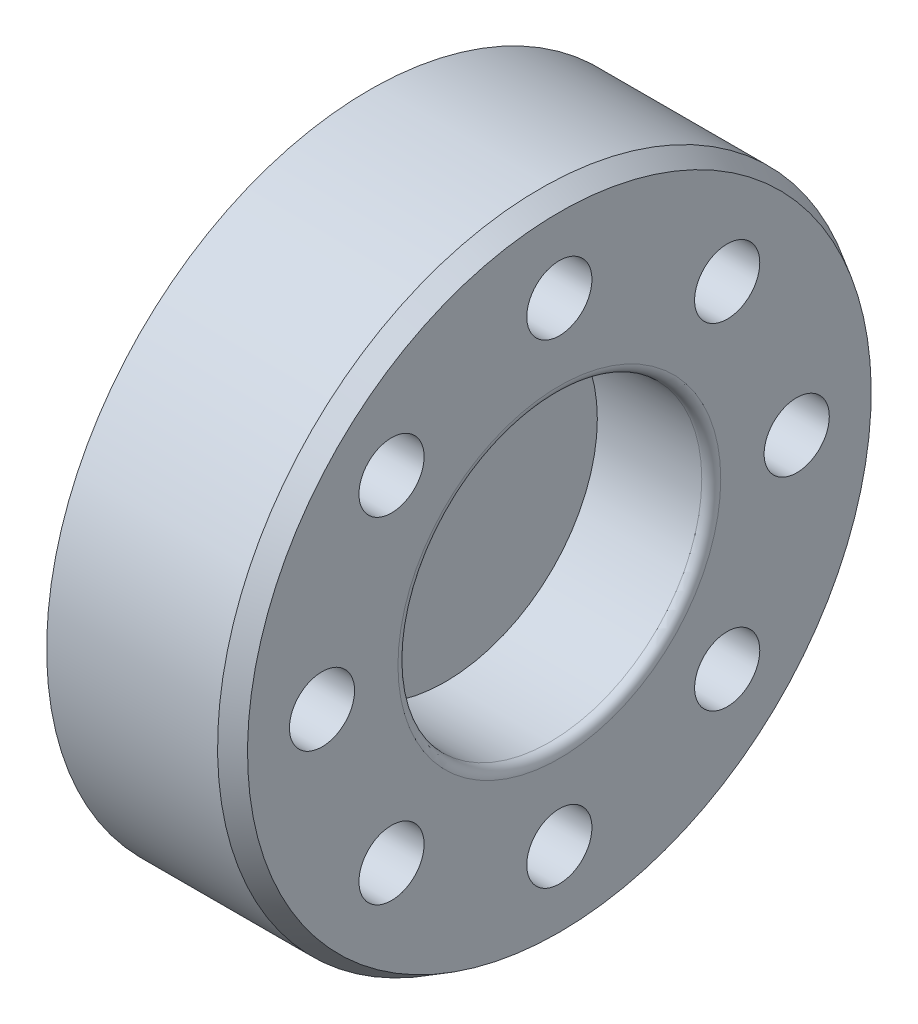
ISO-10303-21;
HEADER;
FILE_DESCRIPTION(('STEP AP214'),'2;1');
FILE_NAME('part.step','',(''),(''),'','','');
FILE_SCHEMA(('AUTOMOTIVE_DESIGN { 1 0 10303 214 1 1 1 1 }'));
ENDSEC;
DATA;
#1=APPLICATION_CONTEXT('core data for automotive mechanical design processes');
#2=APPLICATION_PROTOCOL_DEFINITION('international standard','automotive_design',2000,#1);
#3=PRODUCT_CONTEXT('',#1,'mechanical');
#4=PRODUCT('Part','Part','',(#3));
#5=PRODUCT_RELATED_PRODUCT_CATEGORY('part','',(#4));
#6=PRODUCT_DEFINITION_FORMATION('','',#4);
#7=PRODUCT_DEFINITION_CONTEXT('part definition',#1,'design');
#8=PRODUCT_DEFINITION('design','',#6,#7);
#9=PRODUCT_DEFINITION_SHAPE('','',#8);
#10=(LENGTH_UNIT() NAMED_UNIT(*) SI_UNIT(.MILLI.,.METRE.));
#11=(NAMED_UNIT(*) PLANE_ANGLE_UNIT() SI_UNIT($,.RADIAN.));
#12=(NAMED_UNIT(*) SI_UNIT($,.STERADIAN.) SOLID_ANGLE_UNIT());
#13=UNCERTAINTY_MEASURE_WITH_UNIT(LENGTH_MEASURE(1.E-05),#10,'distance_accuracy_value','');
#14=(GEOMETRIC_REPRESENTATION_CONTEXT(3) GLOBAL_UNCERTAINTY_ASSIGNED_CONTEXT((#13)) GLOBAL_UNIT_ASSIGNED_CONTEXT((#10,
#11,#12)) REPRESENTATION_CONTEXT('',''));
#15=CARTESIAN_POINT('',(0.,0.,0.));
#16=DIRECTION('',(0.,0.,1.));
#17=DIRECTION('',(1.,0.,0.));
#18=AXIS2_PLACEMENT_3D('',#15,#16,#17);
#19=CARTESIAN_POINT('',(50.15,0.,0.));
#20=DIRECTION('',(-1.,0.,0.));
#21=DIRECTION('',(0.,0.,1.));
#22=AXIS2_PLACEMENT_3D('',#19,#20,#21);
#23=PLANE('',#22);
#24=CARTESIAN_POINT('',(50.15,0.,0.));
#25=DIRECTION('',(1.,0.,0.));
#26=DIRECTION('',(0.,0.,-1.));
#27=AXIS2_PLACEMENT_3D('',#24,#25,#26);
#28=CIRCLE('',#27,8.);
#29=CARTESIAN_POINT('',(50.15,0.,-8.));
#30=VERTEX_POINT('',#29);
#31=EDGE_CURVE('E97',#30,#30,#28,.T.);
#32=ORIENTED_EDGE('',*,*,#31,.T.);
#33=EDGE_LOOP('',(#32));
#34=FACE_BOUND('',#33,.T.);
#35=ADVANCED_FACE('F16',(#34),#23,.F.);
#36=CARTESIAN_POINT('',(56.15,0.,0.));
#37=DIRECTION('',(1.,0.,0.));
#38=DIRECTION('',(0.,0.,-1.));
#39=AXIS2_PLACEMENT_3D('',#36,#37,#38);
#40=CYLINDRICAL_SURFACE('',#39,8.);
#41=ORIENTED_EDGE('',*,*,#31,.F.);
#42=EDGE_LOOP('',(#41));
#43=FACE_BOUND('',#42,.T.);
#44=CARTESIAN_POINT('',(55.65,0.,0.));
#45=DIRECTION('',(-1.,0.,0.));
#46=DIRECTION('',(0.,0.,1.));
#47=AXIS2_PLACEMENT_3D('',#44,#45,#46);
#48=CIRCLE('',#47,8.);
#49=CARTESIAN_POINT('',(55.65,0.,8.));
#50=VERTEX_POINT('',#49);
#51=EDGE_CURVE('E86',#50,#50,#48,.T.);
#52=ORIENTED_EDGE('',*,*,#51,.F.);
#53=EDGE_LOOP('',(#52));
#54=FACE_BOUND('',#53,.T.);
#55=ADVANCED_FACE('F78',(#43,#54),#40,.F.);
#56=CARTESIAN_POINT('',(49.1499999998837,8.83883476483184,-8.83883476483185));
#57=DIRECTION('',(1.,0.,0.));
#58=DIRECTION('',(0.,0.,-1.));
#59=AXIS2_PLACEMENT_3D('',#56,#57,#58);
#60=CONICAL_SURFACE('',#59,1.71583499977637,1.02974425840139);
#61=CARTESIAN_POINT('',(48.1190223194972,8.83883476491711,-8.83883476477501));
#62=VERTEX_POINT('',#61);
#63=VERTEX_LOOP('',#62);
#64=FACE_BOUND('',#63,.T.);
#65=CARTESIAN_POINT('',(49.15,8.83883476483184,-8.83883476483185));
#66=DIRECTION('',(1.,0.,0.));
#67=DIRECTION('',(0.,0.,-1.));
#68=AXIS2_PLACEMENT_3D('',#65,#66,#67);
#69=CIRCLE('',#68,1.715835);
#70=CARTESIAN_POINT('',(49.15,8.83883476483184,-10.5546697648318));
#71=VERTEX_POINT('',#70);
#72=EDGE_CURVE('E82',#71,#71,#69,.T.);
#73=ORIENTED_EDGE('',*,*,#72,.T.);
#74=EDGE_LOOP('',(#73));
#75=FACE_BOUND('',#74,.T.);
#76=ADVANCED_FACE('F74',(#64,#75),#60,.F.);
#77=CARTESIAN_POINT('',(49.1500000000542,0.,-12.5));
#78=DIRECTION('',(1.,0.,0.));
#79=DIRECTION('',(0.,0.,-1.));
#80=AXIS2_PLACEMENT_3D('',#77,#78,#79);
#81=CONICAL_SURFACE('',#80,1.7158350000841,1.02974425864919);
#82=CARTESIAN_POINT('',(48.119022319753,5.6843418860808E-11,-12.5));
#83=VERTEX_POINT('',#82);
#84=VERTEX_LOOP('',#83);
#85=FACE_BOUND('',#84,.T.);
#86=CARTESIAN_POINT('',(49.15,0.,-12.5));
#87=DIRECTION('',(1.,0.,0.));
#88=DIRECTION('',(0.,0.,-1.));
#89=AXIS2_PLACEMENT_3D('',#86,#87,#88);
#90=CIRCLE('',#89,1.715835);
#91=CARTESIAN_POINT('',(49.15,0.,-14.215835));
#92=VERTEX_POINT('',#91);
#93=EDGE_CURVE('E85',#92,#92,#90,.T.);
#94=ORIENTED_EDGE('',*,*,#93,.T.);
#95=EDGE_LOOP('',(#94));
#96=FACE_BOUND('',#95,.T.);
#97=ADVANCED_FACE('F77',(#85,#96),#81,.F.);
#98=CARTESIAN_POINT('',(49.1499999998837,-8.83883476483184,-8.83883476483184));
#99=DIRECTION('',(1.,0.,0.));
#100=DIRECTION('',(0.,0.,-1.));
#101=AXIS2_PLACEMENT_3D('',#98,#99,#100);
#102=CONICAL_SURFACE('',#101,1.71583499977638,1.02974425850037);
#103=CARTESIAN_POINT('',(48.1190223196108,-8.838834764775,-8.83883476488868));
#104=VERTEX_POINT('',#103);
#105=VERTEX_LOOP('',#104);
#106=FACE_BOUND('',#105,.T.);
#107=CARTESIAN_POINT('',(49.15,-8.83883476483184,-8.83883476483184));
#108=DIRECTION('',(1.,0.,0.));
#109=DIRECTION('',(0.,0.,-1.));
#110=AXIS2_PLACEMENT_3D('',#107,#108,#109);
#111=CIRCLE('',#110,1.715835);
#112=CARTESIAN_POINT('',(49.15,-8.83883476483184,-10.5546697648318));
#113=VERTEX_POINT('',#112);
#114=EDGE_CURVE('E93',#113,#113,#111,.T.);
#115=ORIENTED_EDGE('',*,*,#114,.T.);
#116=EDGE_LOOP('',(#115));
#117=FACE_BOUND('',#116,.T.);
#118=ADVANCED_FACE('F173',(#106,#117),#102,.F.);
#119=CARTESIAN_POINT('',(49.1500000000542,-12.5,0.));
#120=DIRECTION('',(1.,0.,0.));
#121=DIRECTION('',(0.,0.,-1.));
#122=AXIS2_PLACEMENT_3D('',#119,#120,#121);
#123=CONICAL_SURFACE('',#122,1.7158350000841,1.02974425864919);
#124=CARTESIAN_POINT('',(48.119022319753,-12.5,-5.6843418860808E-11));
#125=VERTEX_POINT('',#124);
#126=VERTEX_LOOP('',#125);
#127=FACE_BOUND('',#126,.T.);
#128=CARTESIAN_POINT('',(49.15,-12.5,0.));
#129=DIRECTION('',(1.,0.,0.));
#130=DIRECTION('',(0.,0.,-1.));
#131=AXIS2_PLACEMENT_3D('',#128,#129,#130);
#132=CIRCLE('',#131,1.715835);
#133=CARTESIAN_POINT('',(49.15,-12.5,-1.715835));
#134=VERTEX_POINT('',#133);
#135=EDGE_CURVE('E166',#134,#134,#132,.T.);
#136=ORIENTED_EDGE('',*,*,#135,.T.);
#137=EDGE_LOOP('',(#136));
#138=FACE_BOUND('',#137,.T.);
#139=ADVANCED_FACE('F251',(#127,#138),#123,.F.);
#140=CARTESIAN_POINT('',(49.1499999998837,-8.83883476483184,8.83883476483184));
#141=DIRECTION('',(1.,0.,0.));
#142=DIRECTION('',(0.,0.,-1.));
#143=AXIS2_PLACEMENT_3D('',#140,#141,#142);
#144=CONICAL_SURFACE('',#143,1.71583499977638,1.0297442584014);
#145=CARTESIAN_POINT('',(48.1190223194972,-8.83883476491711,8.838834764775));
#146=VERTEX_POINT('',#145);
#147=VERTEX_LOOP('',#146);
#148=FACE_BOUND('',#147,.T.);
#149=CARTESIAN_POINT('',(49.15,-8.83883476483184,8.83883476483184));
#150=DIRECTION('',(1.,0.,0.));
#151=DIRECTION('',(0.,0.,-1.));
#152=AXIS2_PLACEMENT_3D('',#149,#150,#151);
#153=CIRCLE('',#152,1.715835);
#154=CARTESIAN_POINT('',(49.15,-8.83883476483184,7.12299976483184));
#155=VERTEX_POINT('',#154);
#156=EDGE_CURVE('E162',#155,#155,#153,.T.);
#157=ORIENTED_EDGE('',*,*,#156,.T.);
#158=EDGE_LOOP('',(#157));
#159=FACE_BOUND('',#158,.T.);
#160=ADVANCED_FACE('F247',(#148,#159),#144,.F.);
#161=CARTESIAN_POINT('',(49.1500000000542,0.,12.5));
#162=DIRECTION('',(1.,0.,0.));
#163=DIRECTION('',(0.,0.,-1.));
#164=AXIS2_PLACEMENT_3D('',#161,#162,#163);
#165=CONICAL_SURFACE('',#164,1.7158350000841,1.02974425864919);
#166=CARTESIAN_POINT('',(48.119022319753,-5.6843418860808E-11,12.5));
#167=VERTEX_POINT('',#166);
#168=VERTEX_LOOP('',#167);
#169=FACE_BOUND('',#168,.T.);
#170=CARTESIAN_POINT('',(49.15,0.,12.5));
#171=DIRECTION('',(1.,0.,0.));
#172=DIRECTION('',(0.,0.,-1.));
#173=AXIS2_PLACEMENT_3D('',#170,#171,#172);
#174=CIRCLE('',#173,1.715835);
#175=CARTESIAN_POINT('',(49.15,0.,10.784165));
#176=VERTEX_POINT('',#175);
#177=EDGE_CURVE('E153',#176,#176,#174,.T.);
#178=ORIENTED_EDGE('',*,*,#177,.T.);
#179=EDGE_LOOP('',(#178));
#180=FACE_BOUND('',#179,.T.);
#181=ADVANCED_FACE('F243',(#169,#180),#165,.F.);
#182=CARTESIAN_POINT('',(49.1499999998837,8.83883476483184,8.83883476483185));
#183=DIRECTION('',(1.,0.,0.));
#184=DIRECTION('',(0.,0.,-1.));
#185=AXIS2_PLACEMENT_3D('',#182,#183,#184);
#186=CONICAL_SURFACE('',#185,1.71583499977638,1.02974425850038);
#187=CARTESIAN_POINT('',(48.1190223196108,8.838834764775,8.83883476488869));
#188=VERTEX_POINT('',#187);
#189=VERTEX_LOOP('',#188);
#190=FACE_BOUND('',#189,.T.);
#191=CARTESIAN_POINT('',(49.15,8.83883476483184,8.83883476483185));
#192=DIRECTION('',(1.,0.,0.));
#193=DIRECTION('',(0.,0.,-1.));
#194=AXIS2_PLACEMENT_3D('',#191,#192,#193);
#195=CIRCLE('',#194,1.715835);
#196=CARTESIAN_POINT('',(49.15,8.83883476483184,7.12299976483185));
#197=VERTEX_POINT('',#196);
#198=EDGE_CURVE('E148',#197,#197,#195,.T.);
#199=ORIENTED_EDGE('',*,*,#198,.T.);
#200=EDGE_LOOP('',(#199));
#201=FACE_BOUND('',#200,.T.);
#202=ADVANCED_FACE('F239',(#190,#201),#186,.F.);
#203=CARTESIAN_POINT('',(49.1500000000542,12.5,0.));
#204=DIRECTION('',(1.,0.,0.));
#205=DIRECTION('',(0.,0.,-1.));
#206=AXIS2_PLACEMENT_3D('',#203,#204,#205);
#207=CONICAL_SURFACE('',#206,1.7158350000841,1.02974425864919);
#208=CARTESIAN_POINT('',(48.119022319753,12.5,5.6843418860808E-11));
#209=VERTEX_POINT('',#208);
#210=VERTEX_LOOP('',#209);
#211=FACE_BOUND('',#210,.T.);
#212=CARTESIAN_POINT('',(49.15,12.5,0.));
#213=DIRECTION('',(1.,0.,0.));
#214=DIRECTION('',(0.,0.,-1.));
#215=AXIS2_PLACEMENT_3D('',#212,#213,#214);
#216=CIRCLE('',#215,1.715835);
#217=CARTESIAN_POINT('',(49.15,12.5,-1.715835));
#218=VERTEX_POINT('',#217);
#219=EDGE_CURVE('E143',#218,#218,#216,.T.);
#220=ORIENTED_EDGE('',*,*,#219,.T.);
#221=EDGE_LOOP('',(#220));
#222=FACE_BOUND('',#221,.T.);
#223=ADVANCED_FACE('F233',(#211,#222),#207,.F.);
#224=CARTESIAN_POINT('',(55.65,0.,0.));
#225=DIRECTION('',(-1.,0.,0.));
#226=DIRECTION('',(0.,0.,1.));
#227=AXIS2_PLACEMENT_3D('',#224,#225,#226);
#228=TOROIDAL_SURFACE('',#227,8.5,0.5);
#229=ORIENTED_EDGE('',*,*,#51,.T.);
#230=EDGE_LOOP('',(#229));
#231=FACE_BOUND('',#230,.T.);
#232=CARTESIAN_POINT('',(56.15,0.,0.));
#233=DIRECTION('',(1.,0.,0.));
#234=DIRECTION('',(0.,0.,-1.));
#235=AXIS2_PLACEMENT_3D('',#232,#233,#234);
#236=CIRCLE('',#235,8.5);
#237=CARTESIAN_POINT('',(56.15,0.,-8.5));
#238=VERTEX_POINT('',#237);
#239=CARTESIAN_POINT('',(56.15,0.,8.5));
#240=VERTEX_POINT('',#239);
#241=EDGE_CURVE('E40',#238,#240,#236,.T.);
#242=ORIENTED_EDGE('',*,*,#241,.T.);
#243=CARTESIAN_POINT('',(56.15,0.,0.));
#244=DIRECTION('',(1.,0.,0.));
#245=DIRECTION('',(0.,0.,1.));
#246=AXIS2_PLACEMENT_3D('',#243,#244,#245);
#247=CIRCLE('',#246,8.5);
#248=EDGE_CURVE('E138',#240,#238,#247,.T.);
#249=ORIENTED_EDGE('',*,*,#248,.T.);
#250=EDGE_LOOP('',(#242,#249));
#251=FACE_BOUND('',#250,.T.);
#252=ADVANCED_FACE('F139',(#231,#251),#228,.T.);
#253=CARTESIAN_POINT('',(56.15,8.83883476483184,-8.83883476483185));
#254=DIRECTION('',(1.,0.,0.));
#255=DIRECTION('',(0.,0.,-1.));
#256=AXIS2_PLACEMENT_3D('',#253,#254,#255);
#257=CYLINDRICAL_SURFACE('',#256,1.715835);
#258=ORIENTED_EDGE('',*,*,#72,.F.);
#259=EDGE_LOOP('',(#258));
#260=FACE_BOUND('',#259,.T.);
#261=CARTESIAN_POINT('',(56.15,8.83883476483184,-8.83883476483185));
#262=DIRECTION('',(1.,0.,0.));
#263=DIRECTION('',(0.,0.,-1.));
#264=AXIS2_PLACEMENT_3D('',#261,#262,#263);
#265=CIRCLE('',#264,1.715835);
#266=CARTESIAN_POINT('',(56.15,8.83883476483184,-10.5546697648318));
#267=VERTEX_POINT('',#266);
#268=EDGE_CURVE('E132',#267,#267,#265,.T.);
#269=ORIENTED_EDGE('',*,*,#268,.T.);
#270=EDGE_LOOP('',(#269));
#271=FACE_BOUND('',#270,.T.);
#272=ADVANCED_FACE('F232',(#260,#271),#257,.F.);
#273=CARTESIAN_POINT('',(56.15,0.,-12.5));
#274=DIRECTION('',(1.,0.,0.));
#275=DIRECTION('',(0.,0.,-1.));
#276=AXIS2_PLACEMENT_3D('',#273,#274,#275);
#277=CYLINDRICAL_SURFACE('',#276,1.715835);
#278=ORIENTED_EDGE('',*,*,#93,.F.);
#279=EDGE_LOOP('',(#278));
#280=FACE_BOUND('',#279,.T.);
#281=CARTESIAN_POINT('',(56.15,0.,-12.5));
#282=DIRECTION('',(1.,0.,0.));
#283=DIRECTION('',(0.,0.,-1.));
#284=AXIS2_PLACEMENT_3D('',#281,#282,#283);
#285=CIRCLE('',#284,1.715835);
#286=CARTESIAN_POINT('',(56.15,0.,-14.215835));
#287=VERTEX_POINT('',#286);
#288=EDGE_CURVE('E129',#287,#287,#285,.T.);
#289=ORIENTED_EDGE('',*,*,#288,.T.);
#290=EDGE_LOOP('',(#289));
#291=FACE_BOUND('',#290,.T.);
#292=ADVANCED_FACE('F179',(#280,#291),#277,.F.);
#293=CARTESIAN_POINT('',(56.15,-8.83883476483184,-8.83883476483184));
#294=DIRECTION('',(1.,0.,0.));
#295=DIRECTION('',(0.,0.,-1.));
#296=AXIS2_PLACEMENT_3D('',#293,#294,#295);
#297=CYLINDRICAL_SURFACE('',#296,1.715835);
#298=ORIENTED_EDGE('',*,*,#114,.F.);
#299=EDGE_LOOP('',(#298));
#300=FACE_BOUND('',#299,.T.);
#301=CARTESIAN_POINT('',(56.15,-8.83883476483184,-8.83883476483184));
#302=DIRECTION('',(1.,0.,0.));
#303=DIRECTION('',(0.,0.,-1.));
#304=AXIS2_PLACEMENT_3D('',#301,#302,#303);
#305=CIRCLE('',#304,1.715835);
#306=CARTESIAN_POINT('',(56.15,-8.83883476483184,-10.5546697648318));
#307=VERTEX_POINT('',#306);
#308=EDGE_CURVE('E125',#307,#307,#305,.T.);
#309=ORIENTED_EDGE('',*,*,#308,.T.);
#310=EDGE_LOOP('',(#309));
#311=FACE_BOUND('',#310,.T.);
#312=ADVANCED_FACE('F175',(#300,#311),#297,.F.);
#313=CARTESIAN_POINT('',(56.15,-12.5,0.));
#314=DIRECTION('',(1.,0.,0.));
#315=DIRECTION('',(0.,0.,-1.));
#316=AXIS2_PLACEMENT_3D('',#313,#314,#315);
#317=CYLINDRICAL_SURFACE('',#316,1.715835);
#318=ORIENTED_EDGE('',*,*,#135,.F.);
#319=EDGE_LOOP('',(#318));
#320=FACE_BOUND('',#319,.T.);
#321=CARTESIAN_POINT('',(56.15,-12.5,0.));
#322=DIRECTION('',(1.,0.,0.));
#323=DIRECTION('',(0.,0.,-1.));
#324=AXIS2_PLACEMENT_3D('',#321,#322,#323);
#325=CIRCLE('',#324,1.715835);
#326=CARTESIAN_POINT('',(56.15,-12.5,-1.715835));
#327=VERTEX_POINT('',#326);
#328=EDGE_CURVE('E121',#327,#327,#325,.T.);
#329=ORIENTED_EDGE('',*,*,#328,.T.);
#330=EDGE_LOOP('',(#329));
#331=FACE_BOUND('',#330,.T.);
#332=ADVANCED_FACE('F178',(#320,#331),#317,.F.);
#333=CARTESIAN_POINT('',(56.15,-8.83883476483184,8.83883476483184));
#334=DIRECTION('',(1.,0.,0.));
#335=DIRECTION('',(0.,0.,-1.));
#336=AXIS2_PLACEMENT_3D('',#333,#334,#335);
#337=CYLINDRICAL_SURFACE('',#336,1.715835);
#338=ORIENTED_EDGE('',*,*,#156,.F.);
#339=EDGE_LOOP('',(#338));
#340=FACE_BOUND('',#339,.T.);
#341=CARTESIAN_POINT('',(56.15,-8.83883476483184,8.83883476483184));
#342=DIRECTION('',(1.,0.,0.));
#343=DIRECTION('',(0.,0.,-1.));
#344=AXIS2_PLACEMENT_3D('',#341,#342,#343);
#345=CIRCLE('',#344,1.715835);
#346=CARTESIAN_POINT('',(56.15,-8.83883476483184,7.12299976483184));
#347=VERTEX_POINT('',#346);
#348=EDGE_CURVE('E117',#347,#347,#345,.T.);
#349=ORIENTED_EDGE('',*,*,#348,.T.);
#350=EDGE_LOOP('',(#349));
#351=FACE_BOUND('',#350,.T.);
#352=ADVANCED_FACE('F311',(#340,#351),#337,.F.);
#353=CARTESIAN_POINT('',(56.15,0.,12.5));
#354=DIRECTION('',(1.,0.,0.));
#355=DIRECTION('',(0.,0.,-1.));
#356=AXIS2_PLACEMENT_3D('',#353,#354,#355);
#357=CYLINDRICAL_SURFACE('',#356,1.715835);
#358=ORIENTED_EDGE('',*,*,#177,.F.);
#359=EDGE_LOOP('',(#358));
#360=FACE_BOUND('',#359,.T.);
#361=CARTESIAN_POINT('',(56.15,0.,12.5));
#362=DIRECTION('',(1.,0.,0.));
#363=DIRECTION('',(0.,0.,-1.));
#364=AXIS2_PLACEMENT_3D('',#361,#362,#363);
#365=CIRCLE('',#364,1.715835);
#366=CARTESIAN_POINT('',(56.15,0.,10.784165));
#367=VERTEX_POINT('',#366);
#368=EDGE_CURVE('E113',#367,#367,#365,.T.);
#369=ORIENTED_EDGE('',*,*,#368,.T.);
#370=EDGE_LOOP('',(#369));
#371=FACE_BOUND('',#370,.T.);
#372=ADVANCED_FACE('F304',(#360,#371),#357,.F.);
#373=CARTESIAN_POINT('',(56.15,8.83883476483184,8.83883476483185));
#374=DIRECTION('',(1.,0.,0.));
#375=DIRECTION('',(0.,0.,-1.));
#376=AXIS2_PLACEMENT_3D('',#373,#374,#375);
#377=CYLINDRICAL_SURFACE('',#376,1.715835);
#378=ORIENTED_EDGE('',*,*,#198,.F.);
#379=EDGE_LOOP('',(#378));
#380=FACE_BOUND('',#379,.T.);
#381=CARTESIAN_POINT('',(56.15,8.83883476483184,8.83883476483185));
#382=DIRECTION('',(1.,0.,0.));
#383=DIRECTION('',(0.,0.,-1.));
#384=AXIS2_PLACEMENT_3D('',#381,#382,#383);
#385=CIRCLE('',#384,1.715835);
#386=CARTESIAN_POINT('',(56.15,8.83883476483184,7.12299976483185));
#387=VERTEX_POINT('',#386);
#388=EDGE_CURVE('E109',#387,#387,#385,.T.);
#389=ORIENTED_EDGE('',*,*,#388,.T.);
#390=EDGE_LOOP('',(#389));
#391=FACE_BOUND('',#390,.T.);
#392=ADVANCED_FACE('F297',(#380,#391),#377,.F.);
#393=CARTESIAN_POINT('',(56.15,12.5,0.));
#394=DIRECTION('',(1.,0.,0.));
#395=DIRECTION('',(0.,0.,-1.));
#396=AXIS2_PLACEMENT_3D('',#393,#394,#395);
#397=CYLINDRICAL_SURFACE('',#396,1.715835);
#398=ORIENTED_EDGE('',*,*,#219,.F.);
#399=EDGE_LOOP('',(#398));
#400=FACE_BOUND('',#399,.T.);
#401=CARTESIAN_POINT('',(56.15,12.5,0.));
#402=DIRECTION('',(1.,0.,0.));
#403=DIRECTION('',(0.,0.,-1.));
#404=AXIS2_PLACEMENT_3D('',#401,#402,#403);
#405=CIRCLE('',#404,1.715835);
#406=CARTESIAN_POINT('',(56.15,12.5,-1.715835));
#407=VERTEX_POINT('',#406);
#408=EDGE_CURVE('E105',#407,#407,#405,.T.);
#409=ORIENTED_EDGE('',*,*,#408,.T.);
#410=EDGE_LOOP('',(#409));
#411=FACE_BOUND('',#410,.T.);
#412=ADVANCED_FACE('F187',(#400,#411),#397,.F.);
#413=CARTESIAN_POINT('',(56.15,15.,0.));
#414=DIRECTION('',(-1.,0.,0.));
#415=DIRECTION('',(0.,0.,1.));
#416=AXIS2_PLACEMENT_3D('',#413,#414,#415);
#417=PLANE('',#416);
#418=ORIENTED_EDGE('',*,*,#408,.F.);
#419=EDGE_LOOP('',(#418));
#420=FACE_BOUND('',#419,.T.);
#421=ORIENTED_EDGE('',*,*,#388,.F.);
#422=EDGE_LOOP('',(#421));
#423=FACE_BOUND('',#422,.T.);
#424=ORIENTED_EDGE('',*,*,#368,.F.);
#425=EDGE_LOOP('',(#424));
#426=FACE_BOUND('',#425,.T.);
#427=ORIENTED_EDGE('',*,*,#348,.F.);
#428=EDGE_LOOP('',(#427));
#429=FACE_BOUND('',#428,.T.);
#430=ORIENTED_EDGE('',*,*,#328,.F.);
#431=EDGE_LOOP('',(#430));
#432=FACE_BOUND('',#431,.T.);
#433=ORIENTED_EDGE('',*,*,#308,.F.);
#434=EDGE_LOOP('',(#433));
#435=FACE_BOUND('',#434,.T.);
#436=ORIENTED_EDGE('',*,*,#288,.F.);
#437=EDGE_LOOP('',(#436));
#438=FACE_BOUND('',#437,.T.);
#439=ORIENTED_EDGE('',*,*,#268,.F.);
#440=EDGE_LOOP('',(#439));
#441=FACE_BOUND('',#440,.T.);
#442=ORIENTED_EDGE('',*,*,#248,.F.);
#443=ORIENTED_EDGE('',*,*,#241,.F.);
#444=EDGE_LOOP('',(#442,#443));
#445=FACE_BOUND('',#444,.T.);
#446=CARTESIAN_POINT('',(56.15,0.,0.));
#447=DIRECTION('',(-1.,0.,0.));
#448=DIRECTION('',(0.,-1.,0.));
#449=AXIS2_PLACEMENT_3D('',#446,#447,#448);
#450=CIRCLE('',#449,16.4226497308104);
#451=CARTESIAN_POINT('',(56.15,-16.4226497308104,0.));
#452=VERTEX_POINT('',#451);
#453=EDGE_CURVE('E101',#452,#452,#450,.T.);
#454=ORIENTED_EDGE('',*,*,#453,.F.);
#455=EDGE_LOOP('',(#454));
#456=FACE_BOUND('',#455,.T.);
#457=ADVANCED_FACE('F183',(#420,#423,#426,#429,#432,#435,#438,#441,#445,#456),#417,.F.);
#458=CARTESIAN_POINT('',(55.15,0.,0.));
#459=DIRECTION('',(-1.,0.,0.));
#460=DIRECTION('',(0.,-1.,0.));
#461=AXIS2_PLACEMENT_3D('',#458,#459,#460);
#462=CONICAL_SURFACE('',#461,17.,0.5235987755983);
#463=ORIENTED_EDGE('',*,*,#453,.T.);
#464=EDGE_LOOP('',(#463));
#465=FACE_BOUND('',#464,.T.);
#466=CARTESIAN_POINT('',(55.15,0.,0.));
#467=DIRECTION('',(1.,0.,0.));
#468=DIRECTION('',(0.,0.,-1.));
#469=AXIS2_PLACEMENT_3D('',#466,#467,#468);
#470=CIRCLE('',#469,17.);
#471=CARTESIAN_POINT('',(55.15,0.,-17.));
#472=VERTEX_POINT('',#471);
#473=EDGE_CURVE('E28',#472,#472,#470,.F.);
#474=ORIENTED_EDGE('',*,*,#473,.F.);
#475=EDGE_LOOP('',(#474));
#476=FACE_BOUND('',#475,.T.);
#477=ADVANCED_FACE('F186',(#465,#476),#462,.T.);
#478=CARTESIAN_POINT('',(53.15,0.,0.));
#479=DIRECTION('',(1.,0.,0.));
#480=DIRECTION('',(0.,0.,-1.));
#481=AXIS2_PLACEMENT_3D('',#478,#479,#480);
#482=CYLINDRICAL_SURFACE('',#481,17.);
#483=ORIENTED_EDGE('',*,*,#473,.T.);
#484=EDGE_LOOP('',(#483));
#485=FACE_BOUND('',#484,.T.);
#486=CARTESIAN_POINT('',(46.15,0.,0.));
#487=DIRECTION('',(1.,0.,0.));
#488=DIRECTION('',(0.,0.,-1.));
#489=AXIS2_PLACEMENT_3D('',#486,#487,#488);
#490=CIRCLE('',#489,17.);
#491=CARTESIAN_POINT('',(46.15,0.,-17.));
#492=VERTEX_POINT('',#491);
#493=EDGE_CURVE('E11',#492,#492,#490,.T.);
#494=ORIENTED_EDGE('',*,*,#493,.T.);
#495=EDGE_LOOP('',(#494));
#496=FACE_BOUND('',#495,.T.);
#497=ADVANCED_FACE('F198',(#485,#496),#482,.T.);
#498=CARTESIAN_POINT('',(46.15,17.,0.));
#499=DIRECTION('',(1.,0.,0.));
#500=DIRECTION('',(0.,0.,-1.));
#501=AXIS2_PLACEMENT_3D('',#498,#499,#500);
#502=PLANE('',#501);
#503=ORIENTED_EDGE('',*,*,#493,.F.);
#504=EDGE_LOOP('',(#503));
#505=FACE_BOUND('',#504,.T.);
#506=ADVANCED_FACE('F269',(#505),#502,.F.);
#507=CLOSED_SHELL('',(#35,#55,#76,#97,#118,#139,#160,#181,#202,#223,#252,#272,#292,#312,#332,
#352,#372,#392,#412,#457,#477,#497,#506));
#508=MANIFOLD_SOLID_BREP('B1',#507);
#509=ADVANCED_BREP_SHAPE_REPRESENTATION('',(#18,#508),#14);
#510=SHAPE_DEFINITION_REPRESENTATION(#9,#509);
ENDSEC;
END-ISO-10303-21;
